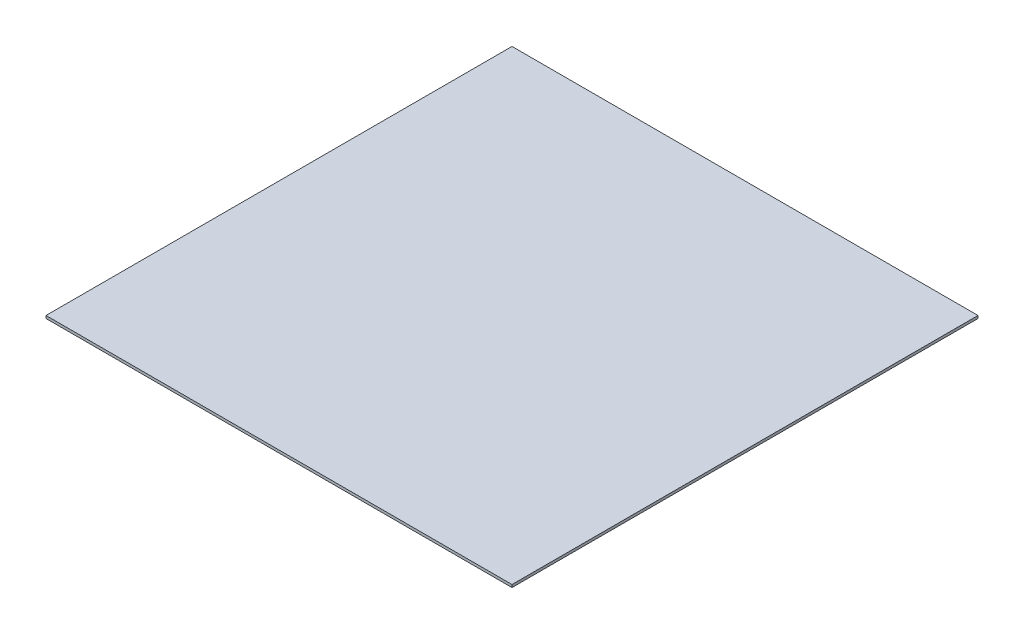
ISO-10303-21;
HEADER;
FILE_DESCRIPTION(('STEP AP214'),'2;1');
FILE_NAME('part.step','',(''),(''),'','','');
FILE_SCHEMA(('AUTOMOTIVE_DESIGN { 1 0 10303 214 1 1 1 1 }'));
ENDSEC;
DATA;
#1=APPLICATION_CONTEXT('core data for automotive mechanical design processes');
#2=APPLICATION_PROTOCOL_DEFINITION('international standard','automotive_design',2000,#1);
#3=PRODUCT_CONTEXT('',#1,'mechanical');
#4=PRODUCT('Part','Part','',(#3));
#5=PRODUCT_RELATED_PRODUCT_CATEGORY('part','',(#4));
#6=PRODUCT_DEFINITION_FORMATION('','',#4);
#7=PRODUCT_DEFINITION_CONTEXT('part definition',#1,'design');
#8=PRODUCT_DEFINITION('design','',#6,#7);
#9=PRODUCT_DEFINITION_SHAPE('','',#8);
#10=(LENGTH_UNIT() NAMED_UNIT(*) SI_UNIT(.MILLI.,.METRE.));
#11=(NAMED_UNIT(*) PLANE_ANGLE_UNIT() SI_UNIT($,.RADIAN.));
#12=(NAMED_UNIT(*) SI_UNIT($,.STERADIAN.) SOLID_ANGLE_UNIT());
#13=UNCERTAINTY_MEASURE_WITH_UNIT(LENGTH_MEASURE(1.E-05),#10,'distance_accuracy_value','');
#14=(GEOMETRIC_REPRESENTATION_CONTEXT(3) GLOBAL_UNCERTAINTY_ASSIGNED_CONTEXT((#13)) GLOBAL_UNIT_ASSIGNED_CONTEXT((#10,
#11,#12)) REPRESENTATION_CONTEXT('',''));
#15=CARTESIAN_POINT('',(0.,0.,0.));
#16=DIRECTION('',(0.,0.,1.));
#17=DIRECTION('',(1.,0.,0.));
#18=AXIS2_PLACEMENT_3D('',#15,#16,#17);
#19=CARTESIAN_POINT('',(0.,0.127,0.));
#20=DIRECTION('',(-1.,0.,0.));
#21=DIRECTION('',(0.,0.,1.));
#22=AXIS2_PLACEMENT_3D('',#19,#20,#21);
#23=PLANE('',#22);
#24=DIRECTION('',(0.,0.,-1.));
#25=VECTOR('',#24,1.);
#26=CARTESIAN_POINT('',(0.,0.,0.));
#27=LINE('',#26,#25);
#28=CARTESIAN_POINT('',(0.,0.,0.));
#29=VERTEX_POINT('',#28);
#30=CARTESIAN_POINT('',(0.,0.,-22.352));
#31=VERTEX_POINT('',#30);
#32=EDGE_CURVE('E98',#29,#31,#27,.T.);
#33=ORIENTED_EDGE('',*,*,#32,.F.);
#34=DIRECTION('',(0.,-1.,0.));
#35=VECTOR('',#34,1.);
#36=CARTESIAN_POINT('',(0.,0.127,0.));
#37=LINE('',#36,#35);
#38=CARTESIAN_POINT('',(0.,0.127,0.));
#39=VERTEX_POINT('',#38);
#40=EDGE_CURVE('E11',#39,#29,#37,.T.);
#41=ORIENTED_EDGE('',*,*,#40,.F.);
#42=DIRECTION('',(0.,0.,-1.));
#43=VECTOR('',#42,1.);
#44=CARTESIAN_POINT('',(0.,0.127,0.));
#45=LINE('',#44,#43);
#46=CARTESIAN_POINT('',(0.,0.127,-22.352));
#47=VERTEX_POINT('',#46);
#48=EDGE_CURVE('E93',#39,#47,#45,.T.);
#49=ORIENTED_EDGE('',*,*,#48,.T.);
#50=DIRECTION('',(0.,-1.,0.));
#51=VECTOR('',#50,1.);
#52=CARTESIAN_POINT('',(0.,0.127,-22.352));
#53=LINE('',#52,#51);
#54=EDGE_CURVE('E36',#47,#31,#53,.T.);
#55=ORIENTED_EDGE('',*,*,#54,.T.);
#56=EDGE_LOOP('',(#33,#41,#49,#55));
#57=FACE_BOUND('',#56,.T.);
#58=ADVANCED_FACE('F33',(#57),#23,.T.);
#59=CARTESIAN_POINT('',(0.,0.127,0.));
#60=DIRECTION('',(0.,0.,-1.));
#61=DIRECTION('',(-1.,0.,0.));
#62=AXIS2_PLACEMENT_3D('',#59,#60,#61);
#63=PLANE('',#62);
#64=DIRECTION('',(1.,0.,0.));
#65=VECTOR('',#64,1.);
#66=CARTESIAN_POINT('',(0.,0.,0.));
#67=LINE('',#66,#65);
#68=CARTESIAN_POINT('',(22.352,0.,0.));
#69=VERTEX_POINT('',#68);
#70=EDGE_CURVE('E66',#29,#69,#67,.T.);
#71=ORIENTED_EDGE('',*,*,#70,.T.);
#72=DIRECTION('',(0.,-1.,0.));
#73=VECTOR('',#72,1.);
#74=CARTESIAN_POINT('',(22.352,0.127,0.));
#75=LINE('',#74,#73);
#76=CARTESIAN_POINT('',(22.352,0.127,0.));
#77=VERTEX_POINT('',#76);
#78=EDGE_CURVE('E42',#77,#69,#75,.T.);
#79=ORIENTED_EDGE('',*,*,#78,.F.);
#80=DIRECTION('',(1.,0.,0.));
#81=VECTOR('',#80,1.);
#82=CARTESIAN_POINT('',(0.,0.127,0.));
#83=LINE('',#82,#81);
#84=EDGE_CURVE('E83',#39,#77,#83,.T.);
#85=ORIENTED_EDGE('',*,*,#84,.F.);
#86=ORIENTED_EDGE('',*,*,#40,.T.);
#87=EDGE_LOOP('',(#71,#79,#85,#86));
#88=FACE_BOUND('',#87,.T.);
#89=ADVANCED_FACE('F108',(#88),#63,.F.);
#90=CARTESIAN_POINT('',(22.352,0.127,0.));
#91=DIRECTION('',(-1.,0.,0.));
#92=DIRECTION('',(0.,0.,1.));
#93=AXIS2_PLACEMENT_3D('',#90,#91,#92);
#94=PLANE('',#93);
#95=DIRECTION('',(0.,0.,-1.));
#96=VECTOR('',#95,1.);
#97=CARTESIAN_POINT('',(22.352,0.,0.));
#98=LINE('',#97,#96);
#99=CARTESIAN_POINT('',(22.352,0.,-22.352));
#100=VERTEX_POINT('',#99);
#101=EDGE_CURVE('E90',#69,#100,#98,.T.);
#102=ORIENTED_EDGE('',*,*,#101,.T.);
#103=DIRECTION('',(0.,-1.,0.));
#104=VECTOR('',#103,1.);
#105=CARTESIAN_POINT('',(22.352,0.127,-22.352));
#106=LINE('',#105,#104);
#107=CARTESIAN_POINT('',(22.352,0.127,-22.352));
#108=VERTEX_POINT('',#107);
#109=EDGE_CURVE('E87',#108,#100,#106,.T.);
#110=ORIENTED_EDGE('',*,*,#109,.F.);
#111=DIRECTION('',(0.,0.,-1.));
#112=VECTOR('',#111,1.);
#113=CARTESIAN_POINT('',(22.352,0.127,0.));
#114=LINE('',#113,#112);
#115=EDGE_CURVE('E78',#77,#108,#114,.T.);
#116=ORIENTED_EDGE('',*,*,#115,.F.);
#117=ORIENTED_EDGE('',*,*,#78,.T.);
#118=EDGE_LOOP('',(#102,#110,#116,#117));
#119=FACE_BOUND('',#118,.T.);
#120=ADVANCED_FACE('F88',(#119),#94,.F.);
#121=CARTESIAN_POINT('',(0.,0.127,-22.352));
#122=DIRECTION('',(0.,0.,-1.));
#123=DIRECTION('',(-1.,0.,0.));
#124=AXIS2_PLACEMENT_3D('',#121,#122,#123);
#125=PLANE('',#124);
#126=DIRECTION('',(1.,0.,0.));
#127=VECTOR('',#126,1.);
#128=CARTESIAN_POINT('',(0.,0.,-22.352));
#129=LINE('',#128,#127);
#130=EDGE_CURVE('E101',#31,#100,#129,.T.);
#131=ORIENTED_EDGE('',*,*,#130,.F.);
#132=ORIENTED_EDGE('',*,*,#54,.F.);
#133=DIRECTION('',(1.,0.,0.));
#134=VECTOR('',#133,1.);
#135=CARTESIAN_POINT('',(0.,0.127,-22.352));
#136=LINE('',#135,#134);
#137=EDGE_CURVE('E82',#47,#108,#136,.T.);
#138=ORIENTED_EDGE('',*,*,#137,.T.);
#139=ORIENTED_EDGE('',*,*,#109,.T.);
#140=EDGE_LOOP('',(#131,#132,#138,#139));
#141=FACE_BOUND('',#140,.T.);
#142=ADVANCED_FACE('F92',(#141),#125,.T.);
#143=CARTESIAN_POINT('',(0.,0.127,0.));
#144=DIRECTION('',(0.,-1.,0.));
#145=DIRECTION('',(0.,0.,-1.));
#146=AXIS2_PLACEMENT_3D('',#143,#144,#145);
#147=PLANE('',#146);
#148=ORIENTED_EDGE('',*,*,#48,.F.);
#149=ORIENTED_EDGE('',*,*,#84,.T.);
#150=ORIENTED_EDGE('',*,*,#115,.T.);
#151=ORIENTED_EDGE('',*,*,#137,.F.);
#152=EDGE_LOOP('',(#148,#149,#150,#151));
#153=FACE_BOUND('',#152,.T.);
#154=ADVANCED_FACE('F81',(#153),#147,.F.);
#155=CARTESIAN_POINT('',(0.,0.,0.));
#156=DIRECTION('',(0.,-1.,0.));
#157=DIRECTION('',(0.,0.,-1.));
#158=AXIS2_PLACEMENT_3D('',#155,#156,#157);
#159=PLANE('',#158);
#160=ORIENTED_EDGE('',*,*,#32,.T.);
#161=ORIENTED_EDGE('',*,*,#130,.T.);
#162=ORIENTED_EDGE('',*,*,#101,.F.);
#163=ORIENTED_EDGE('',*,*,#70,.F.);
#164=EDGE_LOOP('',(#160,#161,#162,#163));
#165=FACE_BOUND('',#164,.T.);
#166=ADVANCED_FACE('F106',(#165),#159,.T.);
#167=CLOSED_SHELL('',(#58,#89,#120,#142,#154,#166));
#168=MANIFOLD_SOLID_BREP('B2',#167);
#169=ADVANCED_BREP_SHAPE_REPRESENTATION('',(#18,#168),#14);
#170=SHAPE_DEFINITION_REPRESENTATION(#9,#169);
ENDSEC;
END-ISO-10303-21;
